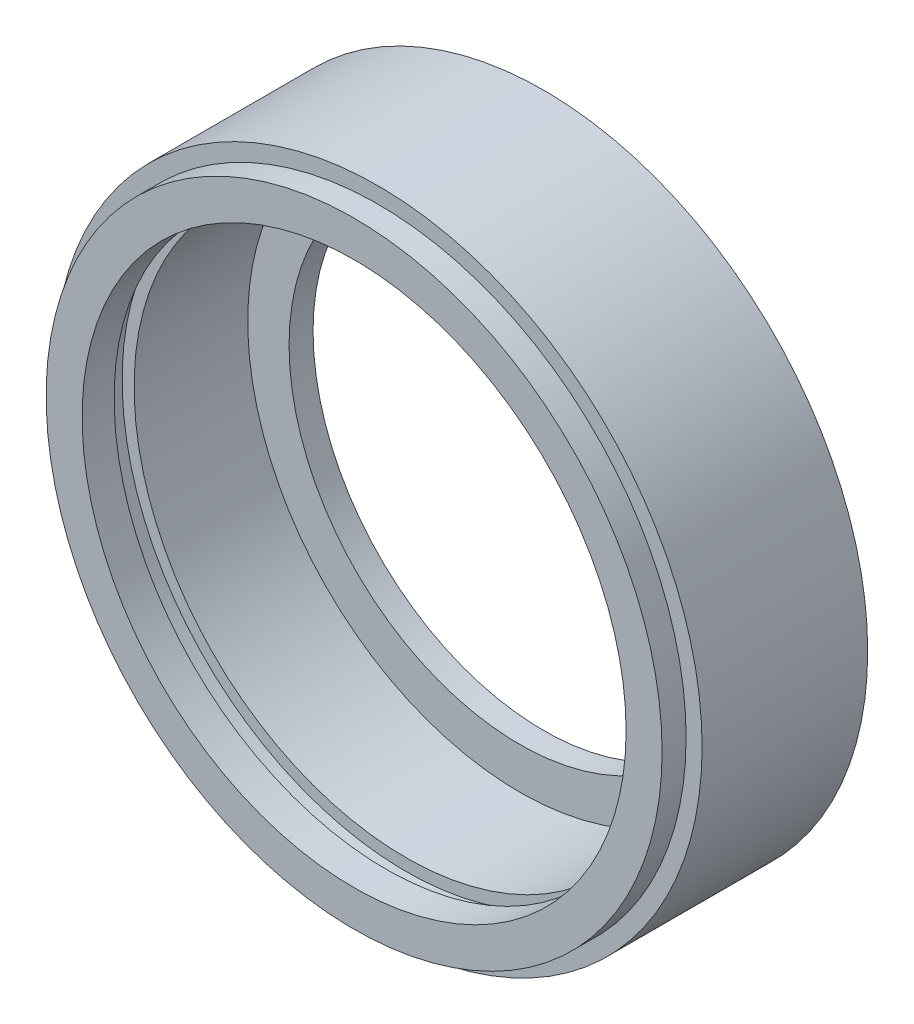
ISO-10303-21;
HEADER;
FILE_DESCRIPTION(('STEP AP214'),'2;1');
FILE_NAME('part.step','',(''),(''),'','','');
FILE_SCHEMA(('AUTOMOTIVE_DESIGN { 1 0 10303 214 1 1 1 1 }'));
ENDSEC;
DATA;
#1=APPLICATION_CONTEXT('core data for automotive mechanical design processes');
#2=APPLICATION_PROTOCOL_DEFINITION('international standard','automotive_design',2000,#1);
#3=PRODUCT_CONTEXT('',#1,'mechanical');
#4=PRODUCT('Part','Part','',(#3));
#5=PRODUCT_RELATED_PRODUCT_CATEGORY('part','',(#4));
#6=PRODUCT_DEFINITION_FORMATION('','',#4);
#7=PRODUCT_DEFINITION_CONTEXT('part definition',#1,'design');
#8=PRODUCT_DEFINITION('design','',#6,#7);
#9=PRODUCT_DEFINITION_SHAPE('','',#8);
#10=(LENGTH_UNIT() NAMED_UNIT(*) SI_UNIT(.MILLI.,.METRE.));
#11=(NAMED_UNIT(*) PLANE_ANGLE_UNIT() SI_UNIT($,.RADIAN.));
#12=(NAMED_UNIT(*) SI_UNIT($,.STERADIAN.) SOLID_ANGLE_UNIT());
#13=UNCERTAINTY_MEASURE_WITH_UNIT(LENGTH_MEASURE(1.E-05),#10,'distance_accuracy_value','');
#14=(GEOMETRIC_REPRESENTATION_CONTEXT(3) GLOBAL_UNCERTAINTY_ASSIGNED_CONTEXT((#13)) GLOBAL_UNIT_ASSIGNED_CONTEXT((#10,
#11,#12)) REPRESENTATION_CONTEXT('',''));
#15=CARTESIAN_POINT('',(0.,0.,0.));
#16=DIRECTION('',(0.,0.,1.));
#17=DIRECTION('',(1.,0.,0.));
#18=AXIS2_PLACEMENT_3D('',#15,#16,#17);
#19=CARTESIAN_POINT('',(0.,0.,1010.5));
#20=DIRECTION('',(0.,0.,1.));
#21=DIRECTION('',(1.,0.,0.));
#22=AXIS2_PLACEMENT_3D('',#19,#20,#21);
#23=CYLINDRICAL_SURFACE('',#22,40.5);
#24=CARTESIAN_POINT('',(0.,0.,20.7000000000002));
#25=DIRECTION('',(0.,0.,1.));
#26=DIRECTION('',(1.,0.,0.));
#27=AXIS2_PLACEMENT_3D('',#24,#25,#26);
#28=CIRCLE('',#27,40.5);
#29=CARTESIAN_POINT('',(40.5,0.,20.7000000000002));
#30=VERTEX_POINT('',#29);
#31=EDGE_CURVE('E10',#30,#30,#28,.T.);
#32=ORIENTED_EDGE('',*,*,#31,.F.);
#33=EDGE_LOOP('',(#32));
#34=FACE_BOUND('',#33,.T.);
#35=CARTESIAN_POINT('',(0.,0.,0.));
#36=DIRECTION('',(0.,0.,1.));
#37=DIRECTION('',(1.,0.,0.));
#38=AXIS2_PLACEMENT_3D('',#35,#36,#37);
#39=CIRCLE('',#38,40.5);
#40=CARTESIAN_POINT('',(40.5,0.,0.));
#41=VERTEX_POINT('',#40);
#42=EDGE_CURVE('E73',#41,#41,#39,.T.);
#43=ORIENTED_EDGE('',*,*,#42,.T.);
#44=EDGE_LOOP('',(#43));
#45=FACE_BOUND('',#44,.T.);
#46=ADVANCED_FACE('F33',(#34,#45),#23,.T.);
#47=CARTESIAN_POINT('',(0.,38.5,20.7000000000001));
#48=DIRECTION('',(0.,0.,-1.));
#49=DIRECTION('',(-1.,0.,0.));
#50=AXIS2_PLACEMENT_3D('',#47,#48,#49);
#51=PLANE('',#50);
#52=CARTESIAN_POINT('',(0.,0.,20.7000000000002));
#53=DIRECTION('',(0.,0.,1.));
#54=DIRECTION('',(1.,0.,0.));
#55=AXIS2_PLACEMENT_3D('',#52,#53,#54);
#56=CIRCLE('',#55,38.5);
#57=CARTESIAN_POINT('',(38.5,0.,20.7000000000002));
#58=VERTEX_POINT('',#57);
#59=EDGE_CURVE('E39',#58,#58,#56,.T.);
#60=ORIENTED_EDGE('',*,*,#59,.F.);
#61=EDGE_LOOP('',(#60));
#62=FACE_BOUND('',#61,.T.);
#63=ORIENTED_EDGE('',*,*,#31,.T.);
#64=EDGE_LOOP('',(#63));
#65=FACE_BOUND('',#64,.T.);
#66=ADVANCED_FACE('F134',(#62,#65),#51,.F.);
#67=CARTESIAN_POINT('',(0.,0.,1010.5));
#68=DIRECTION('',(0.,0.,1.));
#69=DIRECTION('',(1.,0.,0.));
#70=AXIS2_PLACEMENT_3D('',#67,#68,#69);
#71=CYLINDRICAL_SURFACE('',#70,38.5);
#72=CARTESIAN_POINT('',(0.,0.,23.7000000000002));
#73=DIRECTION('',(0.,0.,1.));
#74=DIRECTION('',(1.,0.,0.));
#75=AXIS2_PLACEMENT_3D('',#72,#73,#74);
#76=CIRCLE('',#75,38.5);
#77=CARTESIAN_POINT('',(38.5,0.,23.7000000000002));
#78=VERTEX_POINT('',#77);
#79=EDGE_CURVE('E43',#78,#78,#76,.T.);
#80=ORIENTED_EDGE('',*,*,#79,.F.);
#81=EDGE_LOOP('',(#80));
#82=FACE_BOUND('',#81,.T.);
#83=ORIENTED_EDGE('',*,*,#59,.T.);
#84=EDGE_LOOP('',(#83));
#85=FACE_BOUND('',#84,.T.);
#86=ADVANCED_FACE('F129',(#82,#85),#71,.T.);
#87=CARTESIAN_POINT('',(0.,34.,23.7000000000002));
#88=DIRECTION('',(0.,0.,-1.));
#89=DIRECTION('',(-1.,0.,0.));
#90=AXIS2_PLACEMENT_3D('',#87,#88,#89);
#91=PLANE('',#90);
#92=CARTESIAN_POINT('',(0.,0.,23.7000000000002));
#93=DIRECTION('',(0.,0.,1.));
#94=DIRECTION('',(1.,0.,0.));
#95=AXIS2_PLACEMENT_3D('',#92,#93,#94);
#96=CIRCLE('',#95,34.);
#97=CARTESIAN_POINT('',(34.,0.,23.7000000000002));
#98=VERTEX_POINT('',#97);
#99=EDGE_CURVE('E47',#98,#98,#96,.T.);
#100=ORIENTED_EDGE('',*,*,#99,.F.);
#101=EDGE_LOOP('',(#100));
#102=FACE_BOUND('',#101,.T.);
#103=ORIENTED_EDGE('',*,*,#79,.T.);
#104=EDGE_LOOP('',(#103));
#105=FACE_BOUND('',#104,.T.);
#106=ADVANCED_FACE('F123',(#102,#105),#91,.F.);
#107=CARTESIAN_POINT('',(0.,0.,1010.5));
#108=DIRECTION('',(0.,0.,1.));
#109=DIRECTION('',(1.,0.,0.));
#110=AXIS2_PLACEMENT_3D('',#107,#108,#109);
#111=CYLINDRICAL_SURFACE('',#110,34.);
#112=CARTESIAN_POINT('',(0.,0.,19.7000000000001));
#113=DIRECTION('',(0.,0.,1.));
#114=DIRECTION('',(1.,0.,0.));
#115=AXIS2_PLACEMENT_3D('',#112,#113,#114);
#116=CIRCLE('',#115,34.);
#117=CARTESIAN_POINT('',(34.,0.,19.7000000000001));
#118=VERTEX_POINT('',#117);
#119=EDGE_CURVE('E52',#118,#118,#116,.T.);
#120=ORIENTED_EDGE('',*,*,#119,.F.);
#121=EDGE_LOOP('',(#120));
#122=FACE_BOUND('',#121,.T.);
#123=ORIENTED_EDGE('',*,*,#99,.T.);
#124=EDGE_LOOP('',(#123));
#125=FACE_BOUND('',#124,.T.);
#126=ADVANCED_FACE('F117',(#122,#125),#111,.F.);
#127=CARTESIAN_POINT('',(0.,35.5,19.7000000000001));
#128=DIRECTION('',(0.,0.,1.));
#129=DIRECTION('',(1.,0.,0.));
#130=AXIS2_PLACEMENT_3D('',#127,#128,#129);
#131=PLANE('',#130);
#132=CARTESIAN_POINT('',(0.,0.,19.7000000000001));
#133=DIRECTION('',(0.,0.,1.));
#134=DIRECTION('',(1.,0.,0.));
#135=AXIS2_PLACEMENT_3D('',#132,#133,#134);
#136=CIRCLE('',#135,35.5);
#137=CARTESIAN_POINT('',(35.5,0.,19.7000000000001));
#138=VERTEX_POINT('',#137);
#139=EDGE_CURVE('E55',#138,#138,#136,.T.);
#140=ORIENTED_EDGE('',*,*,#139,.F.);
#141=EDGE_LOOP('',(#140));
#142=FACE_BOUND('',#141,.T.);
#143=ORIENTED_EDGE('',*,*,#119,.T.);
#144=EDGE_LOOP('',(#143));
#145=FACE_BOUND('',#144,.T.);
#146=ADVANCED_FACE('F111',(#142,#145),#131,.F.);
#147=CARTESIAN_POINT('',(0.,0.,1010.5));
#148=DIRECTION('',(0.,0.,1.));
#149=DIRECTION('',(1.,0.,0.));
#150=AXIS2_PLACEMENT_3D('',#147,#148,#149);
#151=CYLINDRICAL_SURFACE('',#150,35.5);
#152=CARTESIAN_POINT('',(0.,0.,17.2000000000001));
#153=DIRECTION('',(0.,0.,1.));
#154=DIRECTION('',(1.,0.,0.));
#155=AXIS2_PLACEMENT_3D('',#152,#153,#154);
#156=CIRCLE('',#155,35.5);
#157=CARTESIAN_POINT('',(35.5,0.,17.2000000000001));
#158=VERTEX_POINT('',#157);
#159=EDGE_CURVE('E58',#158,#158,#156,.T.);
#160=ORIENTED_EDGE('',*,*,#159,.F.);
#161=EDGE_LOOP('',(#160));
#162=FACE_BOUND('',#161,.T.);
#163=ORIENTED_EDGE('',*,*,#139,.T.);
#164=EDGE_LOOP('',(#163));
#165=FACE_BOUND('',#164,.T.);
#166=ADVANCED_FACE('F105',(#162,#165),#151,.F.);
#167=CARTESIAN_POINT('',(0.,35.5,17.2000000000001));
#168=DIRECTION('',(0.,0.,-1.));
#169=DIRECTION('',(-1.,0.,0.));
#170=AXIS2_PLACEMENT_3D('',#167,#168,#169);
#171=PLANE('',#170);
#172=CARTESIAN_POINT('',(0.,0.,17.2000000000001));
#173=DIRECTION('',(0.,0.,1.));
#174=DIRECTION('',(1.,0.,0.));
#175=AXIS2_PLACEMENT_3D('',#172,#173,#174);
#176=CIRCLE('',#175,34.);
#177=CARTESIAN_POINT('',(34.,0.,17.2000000000001));
#178=VERTEX_POINT('',#177);
#179=EDGE_CURVE('E61',#178,#178,#176,.T.);
#180=ORIENTED_EDGE('',*,*,#179,.F.);
#181=EDGE_LOOP('',(#180));
#182=FACE_BOUND('',#181,.T.);
#183=ORIENTED_EDGE('',*,*,#159,.T.);
#184=EDGE_LOOP('',(#183));
#185=FACE_BOUND('',#184,.T.);
#186=ADVANCED_FACE('F99',(#182,#185),#171,.F.);
#187=CARTESIAN_POINT('',(0.,0.,1010.5));
#188=DIRECTION('',(0.,0.,1.));
#189=DIRECTION('',(1.,0.,0.));
#190=AXIS2_PLACEMENT_3D('',#187,#188,#189);
#191=CYLINDRICAL_SURFACE('',#190,34.);
#192=CARTESIAN_POINT('',(0.,0.,2.99999999999989));
#193=DIRECTION('',(0.,0.,1.));
#194=DIRECTION('',(1.,0.,0.));
#195=AXIS2_PLACEMENT_3D('',#192,#193,#194);
#196=CIRCLE('',#195,34.);
#197=CARTESIAN_POINT('',(34.,0.,2.99999999999989));
#198=VERTEX_POINT('',#197);
#199=EDGE_CURVE('E64',#198,#198,#196,.T.);
#200=ORIENTED_EDGE('',*,*,#199,.F.);
#201=EDGE_LOOP('',(#200));
#202=FACE_BOUND('',#201,.T.);
#203=ORIENTED_EDGE('',*,*,#179,.T.);
#204=EDGE_LOOP('',(#203));
#205=FACE_BOUND('',#204,.T.);
#206=ADVANCED_FACE('F93',(#202,#205),#191,.F.);
#207=CARTESIAN_POINT('',(0.,34.,2.99999999999993));
#208=DIRECTION('',(0.,0.,-1.));
#209=DIRECTION('',(-1.,0.,0.));
#210=AXIS2_PLACEMENT_3D('',#207,#208,#209);
#211=PLANE('',#210);
#212=CARTESIAN_POINT('',(0.,0.,2.99999999999989));
#213=DIRECTION('',(0.,0.,1.));
#214=DIRECTION('',(1.,0.,0.));
#215=AXIS2_PLACEMENT_3D('',#212,#213,#214);
#216=CIRCLE('',#215,28.8333333333333);
#217=CARTESIAN_POINT('',(28.8333333333333,0.,2.99999999999989));
#218=VERTEX_POINT('',#217);
#219=EDGE_CURVE('E67',#218,#218,#216,.T.);
#220=ORIENTED_EDGE('',*,*,#219,.F.);
#221=EDGE_LOOP('',(#220));
#222=FACE_BOUND('',#221,.T.);
#223=ORIENTED_EDGE('',*,*,#199,.T.);
#224=EDGE_LOOP('',(#223));
#225=FACE_BOUND('',#224,.T.);
#226=ADVANCED_FACE('F87',(#222,#225),#211,.F.);
#227=CARTESIAN_POINT('',(0.,0.,1010.5));
#228=DIRECTION('',(0.,0.,1.));
#229=DIRECTION('',(1.,0.,0.));
#230=AXIS2_PLACEMENT_3D('',#227,#228,#229);
#231=CYLINDRICAL_SURFACE('',#230,28.8333333333333);
#232=CARTESIAN_POINT('',(0.,0.,0.));
#233=DIRECTION('',(0.,0.,1.));
#234=DIRECTION('',(1.,0.,0.));
#235=AXIS2_PLACEMENT_3D('',#232,#233,#234);
#236=CIRCLE('',#235,28.8333333333333);
#237=CARTESIAN_POINT('',(28.8333333333333,0.,0.));
#238=VERTEX_POINT('',#237);
#239=EDGE_CURVE('E70',#238,#238,#236,.T.);
#240=ORIENTED_EDGE('',*,*,#239,.F.);
#241=EDGE_LOOP('',(#240));
#242=FACE_BOUND('',#241,.T.);
#243=ORIENTED_EDGE('',*,*,#219,.T.);
#244=EDGE_LOOP('',(#243));
#245=FACE_BOUND('',#244,.T.);
#246=ADVANCED_FACE('F81',(#242,#245),#231,.F.);
#247=CARTESIAN_POINT('',(0.,28.8333333333333,0.));
#248=DIRECTION('',(0.,0.,1.));
#249=DIRECTION('',(1.,0.,0.));
#250=AXIS2_PLACEMENT_3D('',#247,#248,#249);
#251=PLANE('',#250);
#252=ORIENTED_EDGE('',*,*,#42,.F.);
#253=EDGE_LOOP('',(#252));
#254=FACE_BOUND('',#253,.T.);
#255=ORIENTED_EDGE('',*,*,#239,.T.);
#256=EDGE_LOOP('',(#255));
#257=FACE_BOUND('',#256,.T.);
#258=ADVANCED_FACE('F78',(#254,#257),#251,.F.);
#259=CLOSED_SHELL('',(#46,#66,#86,#106,#126,#146,#166,#186,#206,#226,#246,#258));
#260=MANIFOLD_SOLID_BREP('B2',#259);
#261=ADVANCED_BREP_SHAPE_REPRESENTATION('',(#18,#260),#14);
#262=SHAPE_DEFINITION_REPRESENTATION(#9,#261);
ENDSEC;
END-ISO-10303-21;
